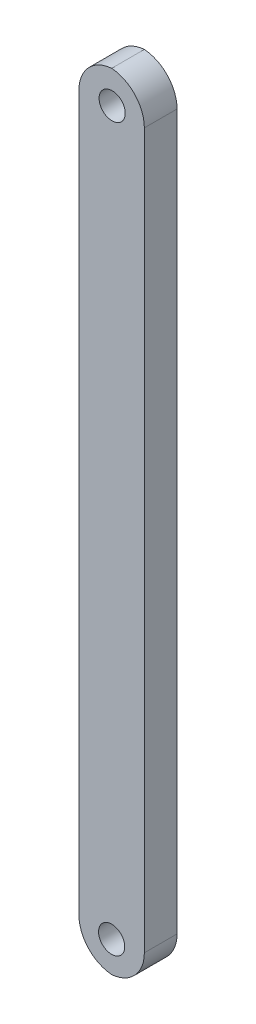
ISO-10303-21;
HEADER;
FILE_DESCRIPTION(('STEP AP214'),'2;1');
FILE_NAME('part.step','',(''),(''),'','','');
FILE_SCHEMA(('AUTOMOTIVE_DESIGN { 1 0 10303 214 1 1 1 1 }'));
ENDSEC;
DATA;
#1=APPLICATION_CONTEXT('core data for automotive mechanical design processes');
#2=APPLICATION_PROTOCOL_DEFINITION('international standard','automotive_design',2000,#1);
#3=PRODUCT_CONTEXT('',#1,'mechanical');
#4=PRODUCT('Part','Part','',(#3));
#5=PRODUCT_RELATED_PRODUCT_CATEGORY('part','',(#4));
#6=PRODUCT_DEFINITION_FORMATION('','',#4);
#7=PRODUCT_DEFINITION_CONTEXT('part definition',#1,'design');
#8=PRODUCT_DEFINITION('design','',#6,#7);
#9=PRODUCT_DEFINITION_SHAPE('','',#8);
#10=(LENGTH_UNIT() NAMED_UNIT(*) SI_UNIT(.MILLI.,.METRE.));
#11=(NAMED_UNIT(*) PLANE_ANGLE_UNIT() SI_UNIT($,.RADIAN.));
#12=(NAMED_UNIT(*) SI_UNIT($,.STERADIAN.) SOLID_ANGLE_UNIT());
#13=UNCERTAINTY_MEASURE_WITH_UNIT(LENGTH_MEASURE(1.E-05),#10,'distance_accuracy_value','');
#14=(GEOMETRIC_REPRESENTATION_CONTEXT(3) GLOBAL_UNCERTAINTY_ASSIGNED_CONTEXT((#13)) GLOBAL_UNIT_ASSIGNED_CONTEXT((#10,
#11,#12)) REPRESENTATION_CONTEXT('',''));
#15=CARTESIAN_POINT('',(0.,0.,0.));
#16=DIRECTION('',(0.,0.,1.));
#17=DIRECTION('',(1.,0.,0.));
#18=AXIS2_PLACEMENT_3D('',#15,#16,#17);
#19=CARTESIAN_POINT('',(-12.7000000000001,-371.4,12.5));
#20=DIRECTION('',(1.,0.,0.));
#21=DIRECTION('',(0.,0.,-1.));
#22=AXIS2_PLACEMENT_3D('',#19,#20,#21);
#23=PLANE('',#22);
#24=DIRECTION('',(0.,-1.,0.));
#25=VECTOR('',#24,1.);
#26=CARTESIAN_POINT('',(-12.7000000000001,-371.4,-12.5));
#27=LINE('',#26,#25);
#28=CARTESIAN_POINT('',(-12.7000000000001,201.6,-12.5));
#29=VERTEX_POINT('',#28);
#30=CARTESIAN_POINT('',(-12.7000000000001,-344.4,-12.5));
#31=VERTEX_POINT('',#30);
#32=EDGE_CURVE('E128',#29,#31,#27,.T.);
#33=ORIENTED_EDGE('',*,*,#32,.T.);
#34=DIRECTION('',(0.,0.,-1.));
#35=VECTOR('',#34,1.);
#36=CARTESIAN_POINT('',(-12.7000000000001,-344.4,12.5));
#37=LINE('',#36,#35);
#38=CARTESIAN_POINT('',(-12.7000000000001,-344.4,12.5));
#39=VERTEX_POINT('',#38);
#40=EDGE_CURVE('E11',#31,#39,#37,.F.);
#41=ORIENTED_EDGE('',*,*,#40,.T.);
#42=DIRECTION('',(0.,-1.,0.));
#43=VECTOR('',#42,1.);
#44=CARTESIAN_POINT('',(-12.7000000000001,-371.4,12.5));
#45=LINE('',#44,#43);
#46=CARTESIAN_POINT('',(-12.7000000000001,201.6,12.5));
#47=VERTEX_POINT('',#46);
#48=EDGE_CURVE('E127',#47,#39,#45,.T.);
#49=ORIENTED_EDGE('',*,*,#48,.F.);
#50=DIRECTION('',(0.,0.,-1.));
#51=VECTOR('',#50,1.);
#52=CARTESIAN_POINT('',(-12.7000000000001,201.6,12.5));
#53=LINE('',#52,#51);
#54=EDGE_CURVE('E55',#47,#29,#53,.T.);
#55=ORIENTED_EDGE('',*,*,#54,.T.);
#56=EDGE_LOOP('',(#33,#41,#49,#55));
#57=FACE_BOUND('',#56,.T.);
#58=ADVANCED_FACE('F45',(#57),#23,.F.);
#59=CARTESIAN_POINT('',(37.2999999999999,-371.4,12.5));
#60=DIRECTION('',(-1.,0.,0.));
#61=DIRECTION('',(0.,0.,1.));
#62=AXIS2_PLACEMENT_3D('',#59,#60,#61);
#63=PLANE('',#62);
#64=DIRECTION('',(0.,1.,0.));
#65=VECTOR('',#64,1.);
#66=CARTESIAN_POINT('',(37.2999999999999,-371.4,12.5));
#67=LINE('',#66,#65);
#68=CARTESIAN_POINT('',(37.2999999999999,-344.4,12.5));
#69=VERTEX_POINT('',#68);
#70=CARTESIAN_POINT('',(37.2999999999999,201.6,12.5));
#71=VERTEX_POINT('',#70);
#72=EDGE_CURVE('E119',#69,#71,#67,.T.);
#73=ORIENTED_EDGE('',*,*,#72,.F.);
#74=DIRECTION('',(0.,0.,-1.));
#75=VECTOR('',#74,1.);
#76=CARTESIAN_POINT('',(37.2999999999999,-344.4,12.5));
#77=LINE('',#76,#75);
#78=CARTESIAN_POINT('',(37.2999999999999,-344.4,-12.5));
#79=VERTEX_POINT('',#78);
#80=EDGE_CURVE('E105',#69,#79,#77,.T.);
#81=ORIENTED_EDGE('',*,*,#80,.T.);
#82=DIRECTION('',(0.,1.,0.));
#83=VECTOR('',#82,1.);
#84=CARTESIAN_POINT('',(37.2999999999999,-371.4,-12.5));
#85=LINE('',#84,#83);
#86=CARTESIAN_POINT('',(37.2999999999999,201.6,-12.5));
#87=VERTEX_POINT('',#86);
#88=EDGE_CURVE('E117',#79,#87,#85,.T.);
#89=ORIENTED_EDGE('',*,*,#88,.T.);
#90=DIRECTION('',(0.,0.,-1.));
#91=VECTOR('',#90,1.);
#92=CARTESIAN_POINT('',(37.2999999999999,201.6,12.5));
#93=LINE('',#92,#91);
#94=EDGE_CURVE('E122',#87,#71,#93,.F.);
#95=ORIENTED_EDGE('',*,*,#94,.T.);
#96=EDGE_LOOP('',(#73,#81,#89,#95));
#97=FACE_BOUND('',#96,.T.);
#98=ADVANCED_FACE('F116',(#97),#63,.F.);
#99=CARTESIAN_POINT('',(0.,0.,12.5));
#100=DIRECTION('',(0.,0.,1.));
#101=DIRECTION('',(1.,0.,0.));
#102=AXIS2_PLACEMENT_3D('',#99,#100,#101);
#103=PLANE('',#102);
#104=CARTESIAN_POINT('',(12.2999999999999,-347.928194148267,12.5));
#105=DIRECTION('',(0.,0.,1.));
#106=DIRECTION('',(1.,0.,0.));
#107=AXIS2_PLACEMENT_3D('',#104,#105,#106);
#108=CIRCLE('',#107,10.);
#109=CARTESIAN_POINT('',(22.2999999999999,-347.928194148267,12.5));
#110=VERTEX_POINT('',#109);
#111=EDGE_CURVE('E175',#110,#110,#108,.T.);
#112=ORIENTED_EDGE('',*,*,#111,.F.);
#113=EDGE_LOOP('',(#112));
#114=FACE_BOUND('',#113,.T.);
#115=CARTESIAN_POINT('',(12.7,203.90113817303,12.5));
#116=DIRECTION('',(0.,0.,1.));
#117=DIRECTION('',(1.,0.,0.));
#118=AXIS2_PLACEMENT_3D('',#115,#116,#117);
#119=CIRCLE('',#118,10.);
#120=CARTESIAN_POINT('',(22.7,203.90113817303,12.5));
#121=VERTEX_POINT('',#120);
#122=EDGE_CURVE('E166',#121,#121,#119,.T.);
#123=ORIENTED_EDGE('',*,*,#122,.F.);
#124=EDGE_LOOP('',(#123));
#125=FACE_BOUND('',#124,.T.);
#126=CARTESIAN_POINT('',(14.2999999999999,-344.4,12.5));
#127=DIRECTION('',(0.,0.,1.));
#128=DIRECTION('',(1.,0.,0.));
#129=AXIS2_PLACEMENT_3D('',#126,#127,#128);
#130=CIRCLE('',#129,27.);
#131=CARTESIAN_POINT('',(12.2999999999999,-371.325824035672,12.5));
#132=VERTEX_POINT('',#131);
#133=EDGE_CURVE('E63',#39,#132,#130,.T.);
#134=ORIENTED_EDGE('',*,*,#133,.T.);
#135=CARTESIAN_POINT('',(10.2999999999999,-344.4,12.5));
#136=DIRECTION('',(0.,0.,1.));
#137=DIRECTION('',(1.,0.,0.));
#138=AXIS2_PLACEMENT_3D('',#135,#136,#137);
#139=CIRCLE('',#138,27.);
#140=EDGE_CURVE('E153',#132,#69,#139,.T.);
#141=ORIENTED_EDGE('',*,*,#140,.T.);
#142=ORIENTED_EDGE('',*,*,#72,.T.);
#143=CARTESIAN_POINT('',(10.2999999999999,201.6,12.5));
#144=DIRECTION('',(0.,0.,1.));
#145=DIRECTION('',(1.,0.,0.));
#146=AXIS2_PLACEMENT_3D('',#143,#144,#145);
#147=CIRCLE('',#146,27.);
#148=CARTESIAN_POINT('',(12.3000000000001,228.525824035672,12.5));
#149=VERTEX_POINT('',#148);
#150=EDGE_CURVE('E70',#71,#149,#147,.T.);
#151=ORIENTED_EDGE('',*,*,#150,.T.);
#152=CARTESIAN_POINT('',(14.2999999999999,201.6,12.5));
#153=DIRECTION('',(0.,0.,1.));
#154=DIRECTION('',(1.,0.,0.));
#155=AXIS2_PLACEMENT_3D('',#152,#153,#154);
#156=CIRCLE('',#155,27.);
#157=EDGE_CURVE('E148',#149,#47,#156,.T.);
#158=ORIENTED_EDGE('',*,*,#157,.T.);
#159=ORIENTED_EDGE('',*,*,#48,.T.);
#160=EDGE_LOOP('',(#134,#141,#142,#151,#158,#159));
#161=FACE_BOUND('',#160,.T.);
#162=ADVANCED_FACE('F178',(#114,#125,#161),#103,.T.);
#163=CARTESIAN_POINT('',(0.,0.,-12.5));
#164=DIRECTION('',(0.,0.,1.));
#165=DIRECTION('',(1.,0.,0.));
#166=AXIS2_PLACEMENT_3D('',#163,#164,#165);
#167=PLANE('',#166);
#168=CARTESIAN_POINT('',(12.2999999999999,-347.928194148267,-12.5));
#169=DIRECTION('',(0.,0.,1.));
#170=DIRECTION('',(1.,0.,0.));
#171=AXIS2_PLACEMENT_3D('',#168,#169,#170);
#172=CIRCLE('',#171,10.);
#173=CARTESIAN_POINT('',(22.2999999999999,-347.928194148267,-12.5));
#174=VERTEX_POINT('',#173);
#175=EDGE_CURVE('E172',#174,#174,#172,.T.);
#176=ORIENTED_EDGE('',*,*,#175,.T.);
#177=EDGE_LOOP('',(#176));
#178=FACE_BOUND('',#177,.T.);
#179=CARTESIAN_POINT('',(12.7,203.90113817303,-12.5));
#180=DIRECTION('',(0.,0.,1.));
#181=DIRECTION('',(1.,0.,0.));
#182=AXIS2_PLACEMENT_3D('',#179,#180,#181);
#183=CIRCLE('',#182,10.);
#184=CARTESIAN_POINT('',(22.7,203.90113817303,-12.5));
#185=VERTEX_POINT('',#184);
#186=EDGE_CURVE('E161',#185,#185,#183,.T.);
#187=ORIENTED_EDGE('',*,*,#186,.T.);
#188=EDGE_LOOP('',(#187));
#189=FACE_BOUND('',#188,.T.);
#190=ORIENTED_EDGE('',*,*,#88,.F.);
#191=CARTESIAN_POINT('',(10.2999999999999,-344.4,-12.5));
#192=DIRECTION('',(0.,0.,1.));
#193=DIRECTION('',(1.,0.,0.));
#194=AXIS2_PLACEMENT_3D('',#191,#192,#193);
#195=CIRCLE('',#194,27.);
#196=CARTESIAN_POINT('',(12.2999999999999,-371.325824035672,-12.5));
#197=VERTEX_POINT('',#196);
#198=EDGE_CURVE('E101',#79,#197,#195,.F.);
#199=ORIENTED_EDGE('',*,*,#198,.T.);
#200=CARTESIAN_POINT('',(14.2999999999999,-344.4,-12.5));
#201=DIRECTION('',(0.,0.,1.));
#202=DIRECTION('',(1.,0.,0.));
#203=AXIS2_PLACEMENT_3D('',#200,#201,#202);
#204=CIRCLE('',#203,27.);
#205=EDGE_CURVE('E111',#197,#31,#204,.F.);
#206=ORIENTED_EDGE('',*,*,#205,.T.);
#207=ORIENTED_EDGE('',*,*,#32,.F.);
#208=CARTESIAN_POINT('',(14.2999999999999,201.6,-12.5));
#209=DIRECTION('',(0.,0.,1.));
#210=DIRECTION('',(1.,0.,0.));
#211=AXIS2_PLACEMENT_3D('',#208,#209,#210);
#212=CIRCLE('',#211,27.);
#213=CARTESIAN_POINT('',(12.3000000000001,228.525824035672,-12.5));
#214=VERTEX_POINT('',#213);
#215=EDGE_CURVE('E141',#29,#214,#212,.F.);
#216=ORIENTED_EDGE('',*,*,#215,.T.);
#217=CARTESIAN_POINT('',(10.2999999999999,201.6,-12.5));
#218=DIRECTION('',(0.,0.,1.));
#219=DIRECTION('',(1.,0.,0.));
#220=AXIS2_PLACEMENT_3D('',#217,#218,#219);
#221=CIRCLE('',#220,27.);
#222=EDGE_CURVE('E121',#214,#87,#221,.F.);
#223=ORIENTED_EDGE('',*,*,#222,.T.);
#224=EDGE_LOOP('',(#190,#199,#206,#207,#216,#223));
#225=FACE_BOUND('',#224,.T.);
#226=ADVANCED_FACE('F124',(#178,#189,#225),#167,.F.);
#227=CARTESIAN_POINT('',(14.2999999999999,-344.4,12.5));
#228=DIRECTION('',(0.,0.,-1.));
#229=DIRECTION('',(-1.,0.,0.));
#230=AXIS2_PLACEMENT_3D('',#227,#228,#229);
#231=CYLINDRICAL_SURFACE('',#230,27.);
#232=DIRECTION('',(0.,0.,-1.));
#233=VECTOR('',#232,1.);
#234=CARTESIAN_POINT('',(12.2999999999999,-371.325824035672,0.));
#235=LINE('',#234,#233);
#236=EDGE_CURVE('E106',#132,#197,#235,.T.);
#237=ORIENTED_EDGE('',*,*,#236,.F.);
#238=ORIENTED_EDGE('',*,*,#133,.F.);
#239=ORIENTED_EDGE('',*,*,#40,.F.);
#240=ORIENTED_EDGE('',*,*,#205,.F.);
#241=EDGE_LOOP('',(#237,#238,#239,#240));
#242=FACE_BOUND('',#241,.T.);
#243=ADVANCED_FACE('F187',(#242),#231,.T.);
#244=CARTESIAN_POINT('',(10.2999999999999,-344.4,12.5));
#245=DIRECTION('',(0.,0.,-1.));
#246=DIRECTION('',(-1.,0.,0.));
#247=AXIS2_PLACEMENT_3D('',#244,#245,#246);
#248=CYLINDRICAL_SURFACE('',#247,27.);
#249=ORIENTED_EDGE('',*,*,#140,.F.);
#250=ORIENTED_EDGE('',*,*,#236,.T.);
#251=ORIENTED_EDGE('',*,*,#198,.F.);
#252=ORIENTED_EDGE('',*,*,#80,.F.);
#253=EDGE_LOOP('',(#249,#250,#251,#252));
#254=FACE_BOUND('',#253,.T.);
#255=ADVANCED_FACE('F104',(#254),#248,.T.);
#256=CARTESIAN_POINT('',(10.2999999999999,201.6,12.5));
#257=DIRECTION('',(0.,0.,-1.));
#258=DIRECTION('',(-1.,0.,0.));
#259=AXIS2_PLACEMENT_3D('',#256,#257,#258);
#260=CYLINDRICAL_SURFACE('',#259,27.);
#261=DIRECTION('',(0.,0.,-1.));
#262=VECTOR('',#261,1.);
#263=CARTESIAN_POINT('',(12.3000000000001,228.525824035672,0.));
#264=LINE('',#263,#262);
#265=EDGE_CURVE('E49',#149,#214,#264,.T.);
#266=ORIENTED_EDGE('',*,*,#265,.F.);
#267=ORIENTED_EDGE('',*,*,#150,.F.);
#268=ORIENTED_EDGE('',*,*,#94,.F.);
#269=ORIENTED_EDGE('',*,*,#222,.F.);
#270=EDGE_LOOP('',(#266,#267,#268,#269));
#271=FACE_BOUND('',#270,.T.);
#272=ADVANCED_FACE('F47',(#271),#260,.T.);
#273=CARTESIAN_POINT('',(14.2999999999999,201.6,12.5));
#274=DIRECTION('',(0.,0.,-1.));
#275=DIRECTION('',(-1.,0.,0.));
#276=AXIS2_PLACEMENT_3D('',#273,#274,#275);
#277=CYLINDRICAL_SURFACE('',#276,27.);
#278=ORIENTED_EDGE('',*,*,#157,.F.);
#279=ORIENTED_EDGE('',*,*,#265,.T.);
#280=ORIENTED_EDGE('',*,*,#215,.F.);
#281=ORIENTED_EDGE('',*,*,#54,.F.);
#282=EDGE_LOOP('',(#278,#279,#280,#281));
#283=FACE_BOUND('',#282,.T.);
#284=ADVANCED_FACE('F181',(#283),#277,.T.);
#285=CARTESIAN_POINT('',(12.7,203.90113817303,-12.5));
#286=DIRECTION('',(0.,0.,1.));
#287=DIRECTION('',(1.,0.,0.));
#288=AXIS2_PLACEMENT_3D('',#285,#286,#287);
#289=CYLINDRICAL_SURFACE('',#288,10.);
#290=ORIENTED_EDGE('',*,*,#186,.F.);
#291=EDGE_LOOP('',(#290));
#292=FACE_BOUND('',#291,.T.);
#293=ORIENTED_EDGE('',*,*,#122,.T.);
#294=EDGE_LOOP('',(#293));
#295=FACE_BOUND('',#294,.T.);
#296=ADVANCED_FACE('F207',(#292,#295),#289,.F.);
#297=CARTESIAN_POINT('',(12.2999999999999,-347.928194148267,-12.5));
#298=DIRECTION('',(0.,0.,1.));
#299=DIRECTION('',(1.,0.,0.));
#300=AXIS2_PLACEMENT_3D('',#297,#298,#299);
#301=CYLINDRICAL_SURFACE('',#300,10.);
#302=ORIENTED_EDGE('',*,*,#175,.F.);
#303=EDGE_LOOP('',(#302));
#304=FACE_BOUND('',#303,.T.);
#305=ORIENTED_EDGE('',*,*,#111,.T.);
#306=EDGE_LOOP('',(#305));
#307=FACE_BOUND('',#306,.T.);
#308=ADVANCED_FACE('F210',(#304,#307),#301,.F.);
#309=CLOSED_SHELL('',(#58,#98,#162,#226,#243,#255,#272,#284,#296,#308));
#310=MANIFOLD_SOLID_BREP('B2',#309);
#311=ADVANCED_BREP_SHAPE_REPRESENTATION('',(#18,#310),#14);
#312=SHAPE_DEFINITION_REPRESENTATION(#9,#311);
ENDSEC;
END-ISO-10303-21;
